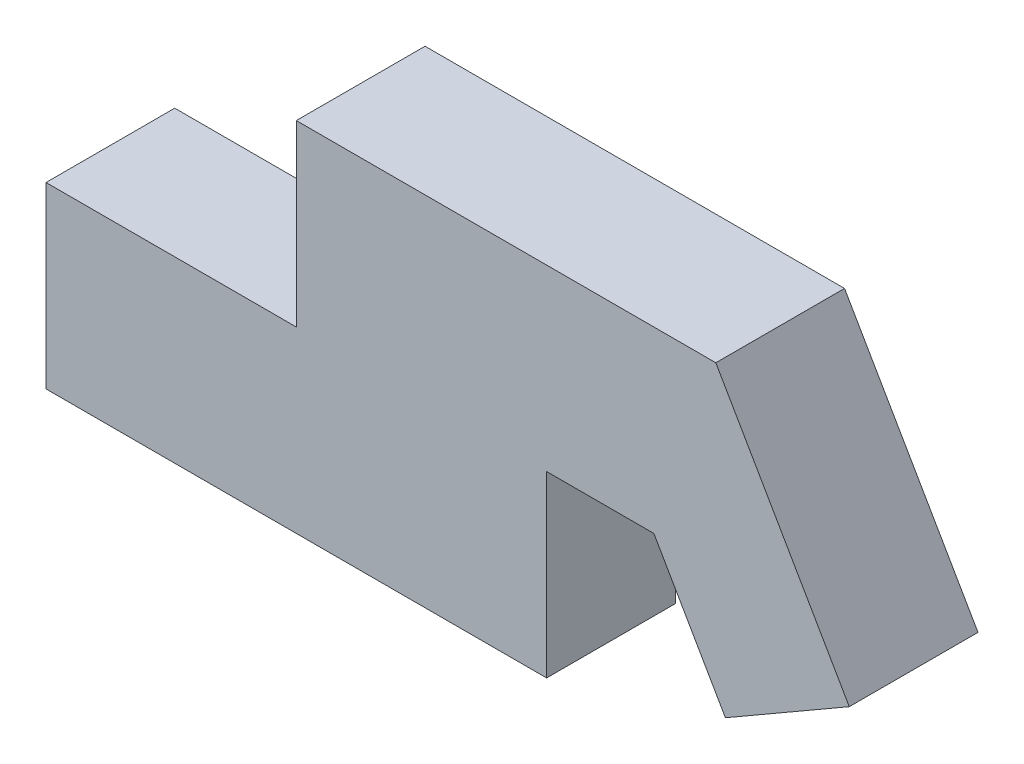
ISO-10303-21;
HEADER;
FILE_DESCRIPTION(('STEP AP214'),'2;1');
FILE_NAME('part.step','',(''),(''),'','','');
FILE_SCHEMA(('AUTOMOTIVE_DESIGN { 1 0 10303 214 1 1 1 1 }'));
ENDSEC;
DATA;
#1=APPLICATION_CONTEXT('core data for automotive mechanical design processes');
#2=APPLICATION_PROTOCOL_DEFINITION('international standard','automotive_design',2000,#1);
#3=PRODUCT_CONTEXT('',#1,'mechanical');
#4=PRODUCT('Part','Part','',(#3));
#5=PRODUCT_RELATED_PRODUCT_CATEGORY('part','',(#4));
#6=PRODUCT_DEFINITION_FORMATION('','',#4);
#7=PRODUCT_DEFINITION_CONTEXT('part definition',#1,'design');
#8=PRODUCT_DEFINITION('design','',#6,#7);
#9=PRODUCT_DEFINITION_SHAPE('','',#8);
#10=(LENGTH_UNIT() NAMED_UNIT(*) SI_UNIT(.MILLI.,.METRE.));
#11=(NAMED_UNIT(*) PLANE_ANGLE_UNIT() SI_UNIT($,.RADIAN.));
#12=(NAMED_UNIT(*) SI_UNIT($,.STERADIAN.) SOLID_ANGLE_UNIT());
#13=UNCERTAINTY_MEASURE_WITH_UNIT(LENGTH_MEASURE(1.E-05),#10,'distance_accuracy_value','');
#14=(GEOMETRIC_REPRESENTATION_CONTEXT(3) GLOBAL_UNCERTAINTY_ASSIGNED_CONTEXT((#13)) GLOBAL_UNIT_ASSIGNED_CONTEXT((#10,
#11,#12)) REPRESENTATION_CONTEXT('',''));
#15=CARTESIAN_POINT('',(0.,0.,0.));
#16=DIRECTION('',(0.,0.,1.));
#17=DIRECTION('',(1.,0.,0.));
#18=AXIS2_PLACEMENT_3D('',#15,#16,#17);
#19=CARTESIAN_POINT('',(0.,25.,18.));
#20=DIRECTION('',(1.,0.,0.));
#21=DIRECTION('',(0.,1.,0.));
#22=AXIS2_PLACEMENT_3D('',#19,#20,#21);
#23=PLANE('',#22);
#24=DIRECTION('',(0.,-1.,0.));
#25=VECTOR('',#24,1.);
#26=CARTESIAN_POINT('',(0.,25.,0.));
#27=LINE('',#26,#25);
#28=CARTESIAN_POINT('',(0.,25.,0.));
#29=VERTEX_POINT('',#28);
#30=CARTESIAN_POINT('',(0.,0.,0.));
#31=VERTEX_POINT('',#30);
#32=EDGE_CURVE('E154',#29,#31,#27,.T.);
#33=ORIENTED_EDGE('',*,*,#32,.T.);
#34=DIRECTION('',(0.,0.,-1.));
#35=VECTOR('',#34,1.);
#36=CARTESIAN_POINT('',(0.,0.,18.));
#37=LINE('',#36,#35);
#38=CARTESIAN_POINT('',(0.,0.,18.));
#39=VERTEX_POINT('',#38);
#40=EDGE_CURVE('E11',#39,#31,#37,.T.);
#41=ORIENTED_EDGE('',*,*,#40,.F.);
#42=DIRECTION('',(0.,-1.,0.));
#43=VECTOR('',#42,1.);
#44=CARTESIAN_POINT('',(0.,25.,18.));
#45=LINE('',#44,#43);
#46=CARTESIAN_POINT('',(0.,25.,18.));
#47=VERTEX_POINT('',#46);
#48=EDGE_CURVE('E182',#47,#39,#45,.T.);
#49=ORIENTED_EDGE('',*,*,#48,.F.);
#50=DIRECTION('',(0.,0.,-1.));
#51=VECTOR('',#50,1.);
#52=CARTESIAN_POINT('',(0.,25.,18.));
#53=LINE('',#52,#51);
#54=EDGE_CURVE('E150',#47,#29,#53,.T.);
#55=ORIENTED_EDGE('',*,*,#54,.T.);
#56=EDGE_LOOP('',(#33,#41,#49,#55));
#57=FACE_BOUND('',#56,.T.);
#58=ADVANCED_FACE('F41',(#57),#23,.F.);
#59=CARTESIAN_POINT('',(0.,0.,18.));
#60=DIRECTION('',(0.,1.,0.));
#61=DIRECTION('',(0.,0.,1.));
#62=AXIS2_PLACEMENT_3D('',#59,#60,#61);
#63=PLANE('',#62);
#64=DIRECTION('',(1.,0.,0.));
#65=VECTOR('',#64,1.);
#66=CARTESIAN_POINT('',(0.,0.,0.));
#67=LINE('',#66,#65);
#68=CARTESIAN_POINT('',(70.,0.,0.));
#69=VERTEX_POINT('',#68);
#70=EDGE_CURVE('E158',#31,#69,#67,.T.);
#71=ORIENTED_EDGE('',*,*,#70,.T.);
#72=DIRECTION('',(0.,0.,-1.));
#73=VECTOR('',#72,1.);
#74=CARTESIAN_POINT('',(70.,0.,18.));
#75=LINE('',#74,#73);
#76=CARTESIAN_POINT('',(70.,0.,18.));
#77=VERTEX_POINT('',#76);
#78=EDGE_CURVE('E50',#77,#69,#75,.T.);
#79=ORIENTED_EDGE('',*,*,#78,.F.);
#80=DIRECTION('',(1.,0.,0.));
#81=VECTOR('',#80,1.);
#82=CARTESIAN_POINT('',(0.,0.,18.));
#83=LINE('',#82,#81);
#84=EDGE_CURVE('E107',#39,#77,#83,.T.);
#85=ORIENTED_EDGE('',*,*,#84,.F.);
#86=ORIENTED_EDGE('',*,*,#40,.T.);
#87=EDGE_LOOP('',(#71,#79,#85,#86));
#88=FACE_BOUND('',#87,.T.);
#89=ADVANCED_FACE('F246',(#88),#63,.F.);
#90=CARTESIAN_POINT('',(70.,0.,18.));
#91=DIRECTION('',(-1.,0.,0.));
#92=DIRECTION('',(0.,0.,1.));
#93=AXIS2_PLACEMENT_3D('',#90,#91,#92);
#94=PLANE('',#93);
#95=DIRECTION('',(0.,1.,0.));
#96=VECTOR('',#95,1.);
#97=CARTESIAN_POINT('',(70.,0.,0.));
#98=LINE('',#97,#96);
#99=CARTESIAN_POINT('',(70.,25.,0.));
#100=VERTEX_POINT('',#99);
#101=EDGE_CURVE('E161',#69,#100,#98,.T.);
#102=ORIENTED_EDGE('',*,*,#101,.T.);
#103=DIRECTION('',(0.,0.,-1.));
#104=VECTOR('',#103,1.);
#105=CARTESIAN_POINT('',(70.,25.,18.));
#106=LINE('',#105,#104);
#107=CARTESIAN_POINT('',(70.,25.,18.));
#108=VERTEX_POINT('',#107);
#109=EDGE_CURVE('E201',#108,#100,#106,.T.);
#110=ORIENTED_EDGE('',*,*,#109,.F.);
#111=DIRECTION('',(0.,1.,0.));
#112=VECTOR('',#111,1.);
#113=CARTESIAN_POINT('',(70.,0.,18.));
#114=LINE('',#113,#112);
#115=EDGE_CURVE('E211',#77,#108,#114,.T.);
#116=ORIENTED_EDGE('',*,*,#115,.F.);
#117=ORIENTED_EDGE('',*,*,#78,.T.);
#118=EDGE_LOOP('',(#102,#110,#116,#117));
#119=FACE_BOUND('',#118,.T.);
#120=ADVANCED_FACE('F209',(#119),#94,.F.);
#121=CARTESIAN_POINT('',(70.,25.,18.));
#122=DIRECTION('',(0.,1.,0.));
#123=DIRECTION('',(0.,0.,1.));
#124=AXIS2_PLACEMENT_3D('',#121,#122,#123);
#125=PLANE('',#124);
#126=DIRECTION('',(1.,0.,0.));
#127=VECTOR('',#126,1.);
#128=CARTESIAN_POINT('',(70.,25.,0.));
#129=LINE('',#128,#127);
#130=CARTESIAN_POINT('',(85.,25.,0.));
#131=VERTEX_POINT('',#130);
#132=EDGE_CURVE('E164',#100,#131,#129,.T.);
#133=ORIENTED_EDGE('',*,*,#132,.T.);
#134=DIRECTION('',(0.,0.,-1.));
#135=VECTOR('',#134,1.);
#136=CARTESIAN_POINT('',(85.,25.,18.));
#137=LINE('',#136,#135);
#138=CARTESIAN_POINT('',(85.,25.,18.));
#139=VERTEX_POINT('',#138);
#140=EDGE_CURVE('E197',#139,#131,#137,.T.);
#141=ORIENTED_EDGE('',*,*,#140,.F.);
#142=DIRECTION('',(1.,0.,0.));
#143=VECTOR('',#142,1.);
#144=CARTESIAN_POINT('',(70.,25.,18.));
#145=LINE('',#144,#143);
#146=EDGE_CURVE('E230',#108,#139,#145,.T.);
#147=ORIENTED_EDGE('',*,*,#146,.F.);
#148=ORIENTED_EDGE('',*,*,#109,.T.);
#149=EDGE_LOOP('',(#133,#141,#147,#148));
#150=FACE_BOUND('',#149,.T.);
#151=ADVANCED_FACE('F220',(#150),#125,.F.);
#152=CARTESIAN_POINT('',(85.,25.,18.));
#153=DIRECTION('',(0.866025403784439,0.499999999999998,0.));
#154=DIRECTION('',(-0.499999999999998,0.86602540378444,0.));
#155=AXIS2_PLACEMENT_3D('',#152,#153,#154);
#156=PLANE('',#155);
#157=DIRECTION('',(0.499999999999998,-0.86602540378444,0.));
#158=VECTOR('',#157,1.);
#159=CARTESIAN_POINT('',(85.,25.,0.));
#160=LINE('',#159,#158);
#161=CARTESIAN_POINT('',(95.,7.67949192431122,0.));
#162=VERTEX_POINT('',#161);
#163=EDGE_CURVE('E167',#131,#162,#160,.T.);
#164=ORIENTED_EDGE('',*,*,#163,.T.);
#165=DIRECTION('',(0.,0.,-1.));
#166=VECTOR('',#165,1.);
#167=CARTESIAN_POINT('',(95.,7.67949192431122,18.));
#168=LINE('',#167,#166);
#169=CARTESIAN_POINT('',(95.,7.67949192431122,18.));
#170=VERTEX_POINT('',#169);
#171=EDGE_CURVE('E193',#170,#162,#168,.T.);
#172=ORIENTED_EDGE('',*,*,#171,.F.);
#173=DIRECTION('',(0.499999999999998,-0.86602540378444,0.));
#174=VECTOR('',#173,1.);
#175=CARTESIAN_POINT('',(85.,25.,18.));
#176=LINE('',#175,#174);
#177=EDGE_CURVE('E226',#139,#170,#176,.T.);
#178=ORIENTED_EDGE('',*,*,#177,.F.);
#179=ORIENTED_EDGE('',*,*,#140,.T.);
#180=EDGE_LOOP('',(#164,#172,#178,#179));
#181=FACE_BOUND('',#180,.T.);
#182=ADVANCED_FACE('F224',(#181),#156,.F.);
#183=CARTESIAN_POINT('',(95.,7.67949192431122,18.));
#184=DIRECTION('',(-0.499999999999998,0.86602540378444,0.));
#185=DIRECTION('',(-0.86602540378444,-0.499999999999998,0.));
#186=AXIS2_PLACEMENT_3D('',#183,#184,#185);
#187=PLANE('',#186);
#188=DIRECTION('',(0.86602540378444,0.499999999999998,0.));
#189=VECTOR('',#188,1.);
#190=CARTESIAN_POINT('',(95.,7.67949192431122,0.));
#191=LINE('',#190,#189);
#192=CARTESIAN_POINT('',(112.320508075689,17.6794919243112,0.));
#193=VERTEX_POINT('',#192);
#194=EDGE_CURVE('E170',#162,#193,#191,.T.);
#195=ORIENTED_EDGE('',*,*,#194,.T.);
#196=DIRECTION('',(0.,0.,-1.));
#197=VECTOR('',#196,1.);
#198=CARTESIAN_POINT('',(112.320508075689,17.6794919243112,18.));
#199=LINE('',#198,#197);
#200=CARTESIAN_POINT('',(112.320508075689,17.6794919243112,18.));
#201=VERTEX_POINT('',#200);
#202=EDGE_CURVE('E189',#201,#193,#199,.T.);
#203=ORIENTED_EDGE('',*,*,#202,.F.);
#204=DIRECTION('',(0.86602540378444,0.499999999999998,0.));
#205=VECTOR('',#204,1.);
#206=CARTESIAN_POINT('',(95.,7.67949192431122,18.));
#207=LINE('',#206,#205);
#208=EDGE_CURVE('E229',#170,#201,#207,.T.);
#209=ORIENTED_EDGE('',*,*,#208,.F.);
#210=ORIENTED_EDGE('',*,*,#171,.T.);
#211=EDGE_LOOP('',(#195,#203,#209,#210));
#212=FACE_BOUND('',#211,.T.);
#213=ADVANCED_FACE('F258',(#212),#187,.F.);
#214=CARTESIAN_POINT('',(112.320508075689,17.6794919243112,18.));
#215=DIRECTION('',(-0.86602540378444,-0.499999999999998,0.));
#216=DIRECTION('',(0.499999999999998,-0.86602540378444,0.));
#217=AXIS2_PLACEMENT_3D('',#214,#215,#216);
#218=PLANE('',#217);
#219=DIRECTION('',(-0.499999999999998,0.86602540378444,0.));
#220=VECTOR('',#219,1.);
#221=CARTESIAN_POINT('',(112.320508075689,17.6794919243112,0.));
#222=LINE('',#221,#220);
#223=CARTESIAN_POINT('',(93.6602540378445,50.,0.));
#224=VERTEX_POINT('',#223);
#225=EDGE_CURVE('E173',#193,#224,#222,.T.);
#226=ORIENTED_EDGE('',*,*,#225,.T.);
#227=DIRECTION('',(0.,0.,-1.));
#228=VECTOR('',#227,1.);
#229=CARTESIAN_POINT('',(93.6602540378445,50.,18.));
#230=LINE('',#229,#228);
#231=CARTESIAN_POINT('',(93.6602540378445,50.,18.));
#232=VERTEX_POINT('',#231);
#233=EDGE_CURVE('E143',#232,#224,#230,.T.);
#234=ORIENTED_EDGE('',*,*,#233,.F.);
#235=DIRECTION('',(-0.499999999999998,0.86602540378444,0.));
#236=VECTOR('',#235,1.);
#237=CARTESIAN_POINT('',(112.320508075689,17.6794919243112,18.));
#238=LINE('',#237,#236);
#239=EDGE_CURVE('E132',#201,#232,#238,.T.);
#240=ORIENTED_EDGE('',*,*,#239,.F.);
#241=ORIENTED_EDGE('',*,*,#202,.T.);
#242=EDGE_LOOP('',(#226,#234,#240,#241));
#243=FACE_BOUND('',#242,.T.);
#244=ADVANCED_FACE('F261',(#243),#218,.F.);
#245=CARTESIAN_POINT('',(93.6602540378445,50.,18.));
#246=DIRECTION('',(0.,-1.,0.));
#247=DIRECTION('',(1.,0.,0.));
#248=AXIS2_PLACEMENT_3D('',#245,#246,#247);
#249=PLANE('',#248);
#250=DIRECTION('',(-1.,0.,0.));
#251=VECTOR('',#250,1.);
#252=CARTESIAN_POINT('',(93.6602540378445,50.,0.));
#253=LINE('',#252,#251);
#254=CARTESIAN_POINT('',(35.,50.,0.));
#255=VERTEX_POINT('',#254);
#256=EDGE_CURVE('E141',#224,#255,#253,.T.);
#257=ORIENTED_EDGE('',*,*,#256,.T.);
#258=DIRECTION('',(0.,0.,-1.));
#259=VECTOR('',#258,1.);
#260=CARTESIAN_POINT('',(35.,50.,18.));
#261=LINE('',#260,#259);
#262=CARTESIAN_POINT('',(35.,50.,18.));
#263=VERTEX_POINT('',#262);
#264=EDGE_CURVE('E138',#263,#255,#261,.T.);
#265=ORIENTED_EDGE('',*,*,#264,.F.);
#266=DIRECTION('',(-1.,0.,0.));
#267=VECTOR('',#266,1.);
#268=CARTESIAN_POINT('',(93.6602540378445,50.,18.));
#269=LINE('',#268,#267);
#270=EDGE_CURVE('E126',#232,#263,#269,.T.);
#271=ORIENTED_EDGE('',*,*,#270,.F.);
#272=ORIENTED_EDGE('',*,*,#233,.T.);
#273=EDGE_LOOP('',(#257,#265,#271,#272));
#274=FACE_BOUND('',#273,.T.);
#275=ADVANCED_FACE('F139',(#274),#249,.F.);
#276=CARTESIAN_POINT('',(35.,50.,18.));
#277=DIRECTION('',(1.,0.,0.));
#278=DIRECTION('',(0.,1.,0.));
#279=AXIS2_PLACEMENT_3D('',#276,#277,#278);
#280=PLANE('',#279);
#281=DIRECTION('',(0.,-1.,0.));
#282=VECTOR('',#281,1.);
#283=CARTESIAN_POINT('',(35.,50.,0.));
#284=LINE('',#283,#282);
#285=CARTESIAN_POINT('',(35.,25.,0.));
#286=VERTEX_POINT('',#285);
#287=EDGE_CURVE('E93',#255,#286,#284,.T.);
#288=ORIENTED_EDGE('',*,*,#287,.T.);
#289=DIRECTION('',(0.,0.,-1.));
#290=VECTOR('',#289,1.);
#291=CARTESIAN_POINT('',(35.,25.,18.));
#292=LINE('',#291,#290);
#293=CARTESIAN_POINT('',(35.,25.,18.));
#294=VERTEX_POINT('',#293);
#295=EDGE_CURVE('E144',#294,#286,#292,.T.);
#296=ORIENTED_EDGE('',*,*,#295,.F.);
#297=DIRECTION('',(0.,-1.,0.));
#298=VECTOR('',#297,1.);
#299=CARTESIAN_POINT('',(35.,50.,18.));
#300=LINE('',#299,#298);
#301=EDGE_CURVE('E130',#263,#294,#300,.T.);
#302=ORIENTED_EDGE('',*,*,#301,.F.);
#303=ORIENTED_EDGE('',*,*,#264,.T.);
#304=EDGE_LOOP('',(#288,#296,#302,#303));
#305=FACE_BOUND('',#304,.T.);
#306=ADVANCED_FACE('F146',(#305),#280,.F.);
#307=CARTESIAN_POINT('',(35.,25.,18.));
#308=DIRECTION('',(0.,-1.,0.));
#309=DIRECTION('',(1.,0.,0.));
#310=AXIS2_PLACEMENT_3D('',#307,#308,#309);
#311=PLANE('',#310);
#312=DIRECTION('',(-1.,0.,0.));
#313=VECTOR('',#312,1.);
#314=CARTESIAN_POINT('',(35.,25.,0.));
#315=LINE('',#314,#313);
#316=EDGE_CURVE('E99',#286,#29,#315,.T.);
#317=ORIENTED_EDGE('',*,*,#316,.T.);
#318=ORIENTED_EDGE('',*,*,#54,.F.);
#319=DIRECTION('',(-1.,0.,0.));
#320=VECTOR('',#319,1.);
#321=CARTESIAN_POINT('',(35.,25.,18.));
#322=LINE('',#321,#320);
#323=EDGE_CURVE('E58',#294,#47,#322,.T.);
#324=ORIENTED_EDGE('',*,*,#323,.F.);
#325=ORIENTED_EDGE('',*,*,#295,.T.);
#326=EDGE_LOOP('',(#317,#318,#324,#325));
#327=FACE_BOUND('',#326,.T.);
#328=ADVANCED_FACE('F270',(#327),#311,.F.);
#329=CARTESIAN_POINT('',(0.,0.,18.));
#330=DIRECTION('',(0.,0.,1.));
#331=DIRECTION('',(1.,0.,0.));
#332=AXIS2_PLACEMENT_3D('',#329,#330,#331);
#333=PLANE('',#332);
#334=ORIENTED_EDGE('',*,*,#48,.T.);
#335=ORIENTED_EDGE('',*,*,#84,.T.);
#336=ORIENTED_EDGE('',*,*,#115,.T.);
#337=ORIENTED_EDGE('',*,*,#146,.T.);
#338=ORIENTED_EDGE('',*,*,#177,.T.);
#339=ORIENTED_EDGE('',*,*,#208,.T.);
#340=ORIENTED_EDGE('',*,*,#239,.T.);
#341=ORIENTED_EDGE('',*,*,#270,.T.);
#342=ORIENTED_EDGE('',*,*,#301,.T.);
#343=ORIENTED_EDGE('',*,*,#323,.T.);
#344=EDGE_LOOP('',(#334,#335,#336,#337,#338,#339,#340,#341,#342,#343));
#345=FACE_BOUND('',#344,.T.);
#346=ADVANCED_FACE('F128',(#345),#333,.T.);
#347=CARTESIAN_POINT('',(0.,0.,0.));
#348=DIRECTION('',(0.,0.,1.));
#349=DIRECTION('',(1.,0.,0.));
#350=AXIS2_PLACEMENT_3D('',#347,#348,#349);
#351=PLANE('',#350);
#352=ORIENTED_EDGE('',*,*,#32,.F.);
#353=ORIENTED_EDGE('',*,*,#316,.F.);
#354=ORIENTED_EDGE('',*,*,#287,.F.);
#355=ORIENTED_EDGE('',*,*,#256,.F.);
#356=ORIENTED_EDGE('',*,*,#225,.F.);
#357=ORIENTED_EDGE('',*,*,#194,.F.);
#358=ORIENTED_EDGE('',*,*,#163,.F.);
#359=ORIENTED_EDGE('',*,*,#132,.F.);
#360=ORIENTED_EDGE('',*,*,#101,.F.);
#361=ORIENTED_EDGE('',*,*,#70,.F.);
#362=EDGE_LOOP('',(#352,#353,#354,#355,#356,#357,#358,#359,#360,#361));
#363=FACE_BOUND('',#362,.T.);
#364=ADVANCED_FACE('F215',(#363),#351,.F.);
#365=CLOSED_SHELL('',(#58,#89,#120,#151,#182,#213,#244,#275,#306,#328,#346,#364));
#366=MANIFOLD_SOLID_BREP('B2',#365);
#367=ADVANCED_BREP_SHAPE_REPRESENTATION('',(#18,#366),#14);
#368=SHAPE_DEFINITION_REPRESENTATION(#9,#367);
ENDSEC;
END-ISO-10303-21;
